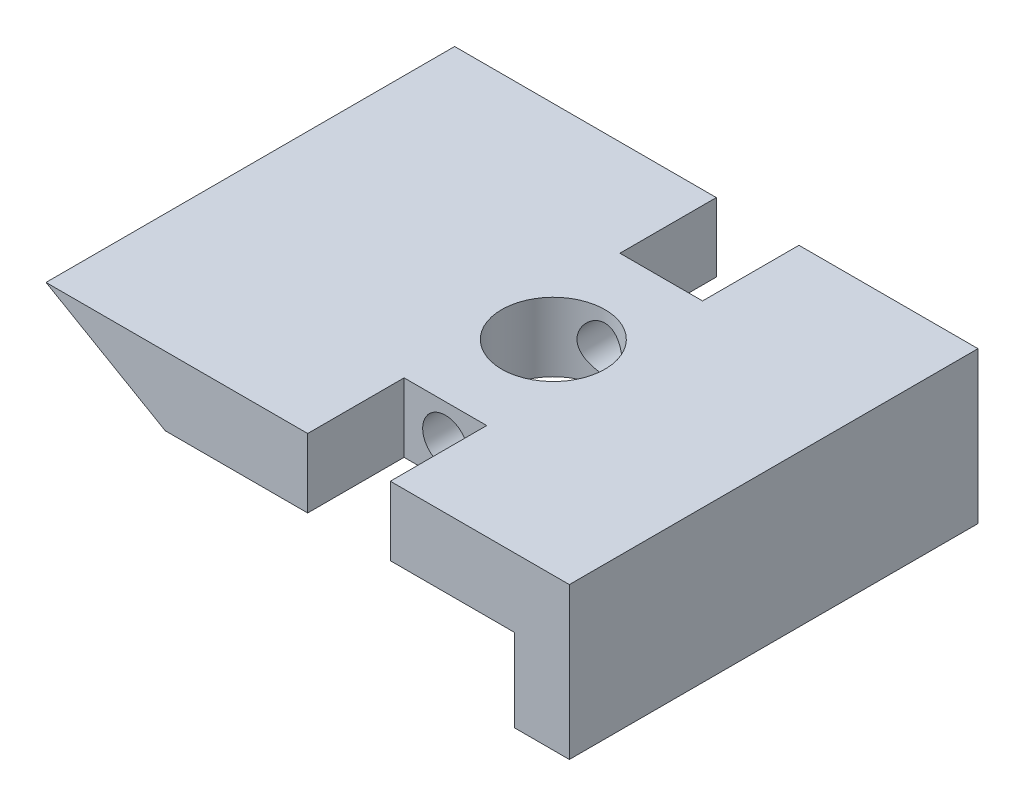
ISO-10303-21;
HEADER;
FILE_DESCRIPTION(('STEP AP214'),'2;1');
FILE_NAME('part.step','',(''),(''),'','','');
FILE_SCHEMA(('AUTOMOTIVE_DESIGN { 1 0 10303 214 1 1 1 1 }'));
ENDSEC;
DATA;
#1=APPLICATION_CONTEXT('core data for automotive mechanical design processes');
#2=APPLICATION_PROTOCOL_DEFINITION('international standard','automotive_design',2000,#1);
#3=PRODUCT_CONTEXT('',#1,'mechanical');
#4=PRODUCT('Part','Part','',(#3));
#5=PRODUCT_RELATED_PRODUCT_CATEGORY('part','',(#4));
#6=PRODUCT_DEFINITION_FORMATION('','',#4);
#7=PRODUCT_DEFINITION_CONTEXT('part definition',#1,'design');
#8=PRODUCT_DEFINITION('design','',#6,#7);
#9=PRODUCT_DEFINITION_SHAPE('','',#8);
#10=(LENGTH_UNIT() NAMED_UNIT(*) SI_UNIT(.MILLI.,.METRE.));
#11=(NAMED_UNIT(*) PLANE_ANGLE_UNIT() SI_UNIT($,.RADIAN.));
#12=(NAMED_UNIT(*) SI_UNIT($,.STERADIAN.) SOLID_ANGLE_UNIT());
#13=UNCERTAINTY_MEASURE_WITH_UNIT(LENGTH_MEASURE(1.E-05),#10,'distance_accuracy_value','');
#14=(GEOMETRIC_REPRESENTATION_CONTEXT(3) GLOBAL_UNCERTAINTY_ASSIGNED_CONTEXT((#13)) GLOBAL_UNIT_ASSIGNED_CONTEXT((#10,
#11,#12)) REPRESENTATION_CONTEXT('',''));
#15=CARTESIAN_POINT('',(0.,0.,0.));
#16=DIRECTION('',(0.,0.,1.));
#17=DIRECTION('',(1.,0.,0.));
#18=AXIS2_PLACEMENT_3D('',#15,#16,#17);
#19=CARTESIAN_POINT('',(3.,0.,-14.836));
#20=DIRECTION('',(0.,0.,1.));
#21=DIRECTION('',(1.,0.,0.));
#22=AXIS2_PLACEMENT_3D('',#19,#20,#21);
#23=CYLINDRICAL_SURFACE('',#22,1.65);
#24=CARTESIAN_POINT('',(4.65,0.,-3.36749164809655));
#25=CARTESIAN_POINT('',(4.64999591948725,-0.0874743691332474,-3.36749607292385));
#26=CARTESIAN_POINT('',(4.64299960015496,-0.175092773934513,-3.37094939684784));
#27=CARTESIAN_POINT('',(4.61531716545798,-0.34775711686567,-3.38429832583538));
#28=CARTESIAN_POINT('',(4.59459592274656,-0.432795867086391,-3.39421046041475));
#29=CARTESIAN_POINT('',(4.54044870220548,-0.597493099250677,-3.41912171212208));
#30=CARTESIAN_POINT('',(4.50707857419381,-0.677173445386291,-3.43409843617774));
#31=CARTESIAN_POINT('',(4.42874832845569,-0.829783884986517,-3.46741736925901));
#32=CARTESIAN_POINT('',(4.38379002894349,-0.902715034980066,-3.48575905018413));
#33=CARTESIAN_POINT('',(4.28021734567749,-1.04487154765316,-3.52516638479344));
#34=CARTESIAN_POINT('',(4.22091990046756,-1.11357209474115,-3.5463309106205));
#35=CARTESIAN_POINT('',(4.09178303274802,-1.240446840094,-3.5881911575404));
#36=CARTESIAN_POINT('',(4.02193928529622,-1.2986166981996,-3.60888668227713));
#37=CARTESIAN_POINT('',(3.86946484491626,-1.4055670834385,-3.64870271327509));
#38=CARTESIAN_POINT('',(3.78637319615618,-1.45374252984987,-3.66769507829857));
#39=CARTESIAN_POINT('',(3.61227632392994,-1.53520034882065,-3.700736202455));
#40=CARTESIAN_POINT('',(3.52127502438019,-1.56849005628031,-3.71478739560396));
#41=CARTESIAN_POINT('',(3.3394662745173,-1.61728382118505,-3.73565913311448));
#42=CARTESIAN_POINT('',(3.24894589824284,-1.63369687425849,-3.74284752867496));
#43=CARTESIAN_POINT('',(3.06617018053507,-1.65122350001049,-3.75052967187645));
#44=CARTESIAN_POINT('',(2.97391564874558,-1.65234404312535,-3.75102646959465));
#45=CARTESIAN_POINT('',(2.79695735459994,-1.63969762210197,-3.74547519866295));
#46=CARTESIAN_POINT('',(2.71216534970809,-1.62693375012661,-3.739868091581));
#47=CARTESIAN_POINT('',(2.5460705321449,-1.58862001141632,-3.72336083389609));
#48=CARTESIAN_POINT('',(2.46476797823857,-1.56306919822084,-3.71246029148675));
#49=CARTESIAN_POINT('',(2.30645273442336,-1.49962622377596,-3.68619520386884));
#50=CARTESIAN_POINT('',(2.22952453920683,-1.46155151512837,-3.67076501619212));
#51=CARTESIAN_POINT('',(2.08294686925941,-1.37433410623967,-3.63691910801703));
#52=CARTESIAN_POINT('',(2.01330005270581,-1.32518738450649,-3.6185023034251));
#53=CARTESIAN_POINT('',(1.87753504589473,-1.2128170119971,-3.57882020061428));
#54=CARTESIAN_POINT('',(1.81210572269681,-1.14879890575555,-3.5574447595915));
#55=CARTESIAN_POINT('',(1.69259260075723,-1.01070787762529,-3.51528240579217));
#56=CARTESIAN_POINT('',(1.63851423294623,-0.936630170451263,-3.49449577883282));
#57=CARTESIAN_POINT('',(1.54117220405855,-0.776800460066403,-3.45502479534648));
#58=CARTESIAN_POINT('',(1.49843008891747,-0.690699088400845,-3.43645839327868));
#59=CARTESIAN_POINT('',(1.42834028609234,-0.511490455495734,-3.40497856582965));
#60=CARTESIAN_POINT('',(1.40098013157646,-0.41838893735563,-3.39206056440346));
#61=CARTESIAN_POINT('',(1.36429227707905,-0.234744535363264,-3.37451456223478));
#62=CARTESIAN_POINT('',(1.35383875555708,-0.144476988157731,-3.36937064835985));
#63=CARTESIAN_POINT('',(1.34792333452705,0.0366498278836368,-3.3664757487194));
#64=CARTESIAN_POINT('',(1.35245516573099,0.127508833402344,-3.36872167133214));
#65=CARTESIAN_POINT('',(1.37535174013094,0.300038323378435,-3.37981562096985));
#66=CARTESIAN_POINT('',(1.39265374352297,0.381886932345066,-3.3881559621082));
#67=CARTESIAN_POINT('',(1.43914744636585,0.541431160999625,-3.40982287754369));
#68=CARTESIAN_POINT('',(1.46834214737761,0.619125726657321,-3.42315071054923));
#69=CARTESIAN_POINT('',(1.53921629690324,0.772027463841041,-3.45400682275722));
#70=CARTESIAN_POINT('',(1.58139272921155,0.846970827739317,-3.47169539316015));
#71=CARTESIAN_POINT('',(1.6765572613445,0.989101543315069,-3.50907546279441));
#72=CARTESIAN_POINT('',(1.72955038819797,1.05628526590526,-3.5287678911715));
#73=CARTESIAN_POINT('',(1.85062358980462,1.1874847750961,-3.57013856276202));
#74=CARTESIAN_POINT('',(1.9196470398001,1.25062896923802,-3.59183160476859));
#75=CARTESIAN_POINT('',(2.06778238636593,1.36462621623266,-3.63309467060809));
#76=CARTESIAN_POINT('',(2.14689558402023,1.41547768147164,-3.65266442003673));
#77=CARTESIAN_POINT('',(2.31400673932617,1.50362813045693,-3.68771558350776));
#78=CARTESIAN_POINT('',(2.40206664806587,1.54082304607771,-3.70316536765515));
#79=CARTESIAN_POINT('',(2.58405684732281,1.59956776607056,-3.72798894821772));
#80=CARTESIAN_POINT('',(2.6779831509097,1.62112807306507,-3.73736682301229));
#81=CARTESIAN_POINT('',(2.8612978165453,1.64656089333973,-3.74847245839303));
#82=CARTESIAN_POINT('',(2.95048512527525,1.65165818539735,-3.75072963755332));
#83=CARTESIAN_POINT('',(3.12843486064658,1.64739798838614,-3.74885512685435));
#84=CARTESIAN_POINT('',(3.21719737386056,1.63804358240264,-3.74472479968784));
#85=CARTESIAN_POINT('',(3.38782932587363,1.60602123171462,-3.7308324127445));
#86=CARTESIAN_POINT('',(3.46983114363675,1.58394115377816,-3.72131934376771));
#87=CARTESIAN_POINT('',(3.62890956243099,1.52777362465028,-3.69776205916142));
#88=CARTESIAN_POINT('',(3.70598528433432,1.49368403723099,-3.68371703743449));
#89=CARTESIAN_POINT('',(3.8569304617613,1.41274147649752,-3.65162935021383));
#90=CARTESIAN_POINT('',(3.93049119711801,1.3653752637279,-3.63343300227536));
#91=CARTESIAN_POINT('',(4.06894266820481,1.2599369507724,-3.59513976322225));
#92=CARTESIAN_POINT('',(4.13382977719906,1.20186039623366,-3.57504208305736));
#93=CARTESIAN_POINT('',(4.25831260974056,1.0713970399496,-3.53324031823005));
#94=CARTESIAN_POINT('',(4.31711532685678,0.998252385431571,-3.51153178279635));
#95=CARTESIAN_POINT('',(4.42177534917193,0.842529476107367,-3.47047923678989));
#96=CARTESIAN_POINT('',(4.46762474174624,0.759945498298501,-3.45113667556083));
#97=CARTESIAN_POINT('',(4.5449162136947,0.587124299309066,-3.41723991894322));
#98=CARTESIAN_POINT('',(4.57632700235197,0.496870953906528,-3.40269614232787));
#99=CARTESIAN_POINT('',(4.62309555077018,0.31164351772581,-3.38064338773551));
#100=CARTESIAN_POINT('',(4.6385071714776,0.216686400884627,-3.3731108155642));
#101=CARTESIAN_POINT('',(4.64703108329939,0.100998496777639,-3.36894448238601));
#102=CARTESIAN_POINT('',(4.64814335262455,0.0808209970433216,-3.36840080987488));
#103=CARTESIAN_POINT('',(4.64962829144477,0.0404315640214764,-3.3676738770119));
#104=CARTESIAN_POINT('',(4.65000094320723,0.02021962992,-3.36749062530128));
#105=CARTESIAN_POINT('',(4.65,0.,-3.36749164809655));
#106=B_SPLINE_CURVE_WITH_KNOTS('',3,(#24,#25,#26,#27,#28,#29,#30,#31,#32,#33,#34,#35,#36,#37,
#38,#39,#40,#41,#42,#43,#44,#45,#46,#47,#48,#49,#50,#51,#52,#53,#54,#55,#56,#57,#58,#59,#60,#61,
#62,#63,#64,#65,#66,#67,#68,#69,#70,#71,#72,#73,#74,#75,#76,#77,#78,#79,#80,#81,#82,#83,#84,#85,
#86,#87,#88,#89,#90,#91,#92,#93,#94,#95,#96,#97,#98,#99,#100,#101,#102,#103,#104,#105),
.UNSPECIFIED.,.T.,.F.,(4,2,2,2,2,2,2,2,2,2,2,2,2,2,2,2,2,2,2,2,2,2,2,2,2,2,2,2,2,2,2,2,2,2,2,2,
2,2,2,2,4),(0.,0.262337992001349,0.52535001551118,0.787214015160152,1.04903695265106,
1.32739302247777,1.60586355517072,1.89807751150631,2.19014732125288,2.46549872058573,
2.74072460857159,2.9973112845901,3.25391695538524,3.51444216606865,3.77506215572741,
4.05582705551463,4.33672598422601,4.62890596840992,4.92084880275994,5.1924046605751,
5.46384692437079,5.71493513596501,5.96608675823259,6.22839495294345,6.49082533337074,
6.77759301230099,7.06439770769602,7.35334470453729,7.64209741960136,7.90880391080322,
8.17545351143564,8.43067328899049,8.68593848747794,8.95289970595717,9.21997220307097,
9.50762420315226,9.79545153931286,10.0838997352209,10.371373694431,10.4320114560409,
10.4926506714452),.UNSPECIFIED.);
#107=CARTESIAN_POINT('',(4.65,0.,-3.36749164809655));
#108=VERTEX_POINT('',#107);
#109=EDGE_CURVE('E189',#108,#108,#106,.T.);
#110=ORIENTED_EDGE('',*,*,#109,.F.);
#111=EDGE_LOOP('',(#110));
#112=FACE_BOUND('',#111,.T.);
#113=CARTESIAN_POINT('',(3.,0.,-7.835));
#114=DIRECTION('',(0.,0.,1.));
#115=DIRECTION('',(1.,0.,0.));
#116=AXIS2_PLACEMENT_3D('',#113,#114,#115);
#117=CIRCLE('',#116,1.65);
#118=CARTESIAN_POINT('',(4.65,0.,-7.835));
#119=VERTEX_POINT('',#118);
#120=EDGE_CURVE('E522',#119,#119,#117,.T.);
#121=ORIENTED_EDGE('',*,*,#120,.F.);
#122=EDGE_LOOP('',(#121));
#123=FACE_BOUND('',#122,.T.);
#124=ADVANCED_FACE('F45',(#112,#123),#23,.F.);
#125=CARTESIAN_POINT('',(3.,-1.65,3.75));
#126=CARTESIAN_POINT('',(3.08794065243915,-1.64999603822561,3.74999677525689));
#127=CARTESIAN_POINT('',(3.17602118872722,-1.64292811014754,3.7468719189208));
#128=CARTESIAN_POINT('',(3.34965330491862,-1.61493414299233,3.734683166008));
#129=CARTESIAN_POINT('',(3.43519818666942,-1.59397431770864,3.72560479056562));
#130=CARTESIAN_POINT('',(3.60097235797527,-1.5391312845056,3.70247374212791));
#131=CARTESIAN_POINT('',(3.68121929706646,-1.505293822675,3.68843868963418));
#132=CARTESIAN_POINT('',(3.83481096834596,-1.42585820871192,3.65674015300381));
#133=CARTESIAN_POINT('',(3.90815735131846,-1.38026287916687,3.63907753990429));
#134=CARTESIAN_POINT('',(4.05000163649842,-1.27598104842036,3.60078615738986));
#135=CARTESIAN_POINT('',(4.11807366426439,-1.21675391782859,3.58005322837619));
#136=CARTESIAN_POINT('',(4.2436925761984,-1.08803679555134,3.53837779505836));
#137=CARTESIAN_POINT('',(4.30123331014303,-1.01854084946946,3.51743517577732));
#138=CARTESIAN_POINT('',(4.40737198125606,-0.866527492524002,3.47638120662905));
#139=CARTESIAN_POINT('',(4.45528386928224,-0.783497192018437,3.45638307676996));
#140=CARTESIAN_POINT('',(4.53627172599083,-0.609555260312117,3.4211597332649));
#141=CARTESIAN_POINT('',(4.56935619199839,-0.518648178890969,3.40593178742375));
#142=CARTESIAN_POINT('',(4.61794121689661,-0.336431274272992,3.3831135312385));
#143=CARTESIAN_POINT('',(4.63426566626132,-0.245387501455808,3.37516767353209));
#144=CARTESIAN_POINT('',(4.65143054751147,-0.0615333461945671,3.3668053594707));
#145=CARTESIAN_POINT('',(4.65228100759649,0.0312758530848424,3.36638402671406));
#146=CARTESIAN_POINT('',(4.63908919688508,0.207355873544219,3.3728210640382));
#147=CARTESIAN_POINT('',(4.6263414186449,0.290751689794494,3.37904671722602));
#148=CARTESIAN_POINT('',(4.58850520692875,0.454071225614267,3.39699646382114));
#149=CARTESIAN_POINT('',(4.56341407162607,0.533994180841886,3.40872176101459));
#150=CARTESIAN_POINT('',(4.50110649630305,0.690226926082278,3.43662073577462));
#151=CARTESIAN_POINT('',(4.46363227970243,0.766416489003947,3.45288773136686));
#152=CARTESIAN_POINT('',(4.37780710670809,0.911743878376031,3.48802159021638));
#153=CARTESIAN_POINT('',(4.32945161231713,0.980878745156235,3.50688953691531));
#154=CARTESIAN_POINT('',(4.21783776896922,1.1170679833526,3.54728261097474));
#155=CARTESIAN_POINT('',(4.15359849475329,1.18329659100235,3.56888963165699));
#156=CARTESIAN_POINT('',(4.01473808953318,1.30433611063186,3.61082599340459));
#157=CARTESIAN_POINT('',(3.94011395212262,1.35914370472459,3.63115496199219));
#158=CARTESIAN_POINT('',(3.7798454417349,1.45719190039968,3.66896451776513));
#159=CARTESIAN_POINT('',(3.69394811565676,1.50005943159355,3.68634771561839));
#160=CARTESIAN_POINT('',(3.51519989197508,1.57043908051859,3.71554130843415));
#161=CARTESIAN_POINT('',(3.42235333017466,1.59796068385571,3.72735514522372));
#162=CARTESIAN_POINT('',(3.23921022750968,1.63505304083377,3.74341295596741));
#163=CARTESIAN_POINT('',(3.14917854061997,1.64572966452197,3.74812228788192));
#164=CARTESIAN_POINT('',(2.96849247665595,1.65217171911425,3.75095455785044));
#165=CARTESIAN_POINT('',(2.87783831540075,1.64794208106068,3.74907967398628));
#166=CARTESIAN_POINT('',(2.70390665287527,1.62544881834208,3.73925037459651));
#167=CARTESIAN_POINT('',(2.62050230959726,1.60799437581934,3.73164663418775));
#168=CARTESIAN_POINT('',(2.45791706209694,1.56071027218963,3.71151728629914));
#169=CARTESIAN_POINT('',(2.37873667607145,1.53087909662229,3.69899107649862));
#170=CARTESIAN_POINT('',(2.22404079862632,1.45873229578337,3.66971134498956));
#171=CARTESIAN_POINT('',(2.14871703627142,1.41605581574277,3.65283800179973));
#172=CARTESIAN_POINT('',(2.00602810222664,1.31982329381418,3.61662102234894));
#173=CARTESIAN_POINT('',(1.93866640117435,1.26626253496257,3.5972763164179));
#174=CARTESIAN_POINT('',(1.80819611837274,1.14484038573232,3.55628214760163));
#175=CARTESIAN_POINT('',(1.74584598439285,1.07618271743489,3.53457144282308));
#176=CARTESIAN_POINT('',(1.63330445356359,0.929097206857131,3.49260064747062));
#177=CARTESIAN_POINT('',(1.58311709508679,0.850666132592151,3.47234104026915));
#178=CARTESIAN_POINT('',(1.49540307748589,0.683921591275962,3.43526035744154));
#179=CARTESIAN_POINT('',(1.45817723591055,0.595429542818637,3.4185241503665));
#180=CARTESIAN_POINT('',(1.39950438017547,0.412456963898668,3.39145640297362));
#181=CARTESIAN_POINT('',(1.37804232181517,0.31798223681692,3.38111875766089));
#182=CARTESIAN_POINT('',(1.35307874998712,0.134229339541118,3.36902436868046));
#183=CARTESIAN_POINT('',(1.34822601990919,0.0451768053067855,3.36662264808986));
#184=CARTESIAN_POINT('',(1.35292803694661,-0.132443324028021,3.36892598901368));
#185=CARTESIAN_POINT('',(1.36247987258739,-0.221011013494953,3.37362961438419));
#186=CARTESIAN_POINT('',(1.39454415171674,-0.389834130472385,3.38899632048545));
#187=CARTESIAN_POINT('',(1.41627535473376,-0.470274087988891,3.39929913530276));
#188=CARTESIAN_POINT('',(1.4712672768033,-0.626361280798593,3.42438089295876));
#189=CARTESIAN_POINT('',(1.50453131275969,-0.702007129869672,3.43916112337134));
#190=CARTESIAN_POINT('',(1.58406507679427,-0.851619735953305,3.47269356886383));
#191=CARTESIAN_POINT('',(1.63102681157857,-0.925174495154697,3.49163847278619));
#192=CARTESIAN_POINT('',(1.7357127896172,-1.06377992281056,3.53089238653571));
#193=CARTESIAN_POINT('',(1.79344141213049,-1.12882711256769,3.55120194925799));
#194=CARTESIAN_POINT('',(1.92382903951875,-1.25428003578287,3.59296880703805));
#195=CARTESIAN_POINT('',(1.99734015606778,-1.31382091586417,3.6143768693599));
#196=CARTESIAN_POINT('',(2.15406955877593,-1.41980560454866,3.65423468677977));
#197=CARTESIAN_POINT('',(2.23729223810855,-1.46624345307615,3.67268309400139));
#198=CARTESIAN_POINT('',(2.41023740744422,-1.54387701756614,3.70436408768263));
#199=CARTESIAN_POINT('',(2.49986734754799,-1.57525320509647,3.71765804406783));
#200=CARTESIAN_POINT('',(2.68371482188615,-1.62216171678277,3.73777368374933));
#201=CARTESIAN_POINT('',(2.77791736039553,-1.63774259010252,3.74461519501638));
#202=CARTESIAN_POINT('',(2.89387606102141,-1.64672172070879,3.7485588513459));
#203=CARTESIAN_POINT('',(2.91507632147087,-1.64794995964319,3.74909837906909));
#204=CARTESIAN_POINT('',(2.95751499929637,-1.64958958196251,3.74981934473969));
#205=CARTESIAN_POINT('',(2.97875341705226,-1.65000095717016,3.75000077910238));
#206=CARTESIAN_POINT('',(3.,-1.65,3.75));
#207=B_SPLINE_CURVE_WITH_KNOTS('',3,(#125,#126,#127,#128,#129,#130,#131,#132,#133,#134,#135,
#136,#137,#138,#139,#140,#141,#142,#143,#144,#145,#146,#147,#148,#149,#150,#151,#152,#153,#154,
#155,#156,#157,#158,#159,#160,#161,#162,#163,#164,#165,#166,#167,#168,#169,#170,#171,#172,#173,
#174,#175,#176,#177,#178,#179,#180,#181,#182,#183,#184,#185,#186,#187,#188,#189,#190,#191,#192,
#193,#194,#195,#196,#197,#198,#199,#200,#201,#202,#203,#204,#205,#206),.UNSPECIFIED.,.T.,.F.,(4,
2,2,2,2,2,2,2,2,2,2,2,2,2,2,2,2,2,2,2,2,2,2,2,2,2,2,2,2,2,2,2,2,2,2,2,2,2,2,2,4),(0.,
0.263734510147988,0.52811280905045,0.791560575603074,1.05494515780487,1.33150079465859,
1.60821742685178,1.90051649596435,2.19264783893791,2.46960925800041,2.74639118079142,
2.99899429642278,3.25165272874969,3.50994222706956,3.76833964437948,4.05135561937526,
4.33445369828947,4.62559874662744,4.91656363268483,5.18748705235547,5.45832085804592,
5.71380105020368,5.96931251303604,6.23280504553125,6.49641201330446,6.78088013255853,
7.06544257396593,7.35622693243307,7.64673341835486,7.91295937269032,8.17913152420861,
8.42991502344918,8.68077070926696,8.94756356427704,9.21446517058845,9.50405959505639,
9.79378553355286,10.0799474542432,10.3652271238324,10.4289451074685,10.4926637289549),.UNSPECIFIED.);
#208=CARTESIAN_POINT('',(3.,-1.65,3.75));
#209=VERTEX_POINT('',#208);
#210=EDGE_CURVE('E198',#209,#209,#207,.T.);
#211=ORIENTED_EDGE('',*,*,#210,.F.);
#212=EDGE_LOOP('',(#211));
#213=FACE_BOUND('',#212,.T.);
#214=CARTESIAN_POINT('',(3.,0.,7.835));
#215=DIRECTION('',(0.,0.,1.));
#216=DIRECTION('',(1.,0.,0.));
#217=AXIS2_PLACEMENT_3D('',#214,#215,#216);
#218=CIRCLE('',#217,1.65);
#219=CARTESIAN_POINT('',(4.65,0.,7.835));
#220=VERTEX_POINT('',#219);
#221=EDGE_CURVE('E482',#220,#220,#218,.T.);
#222=ORIENTED_EDGE('',*,*,#221,.T.);
#223=EDGE_LOOP('',(#222));
#224=FACE_BOUND('',#223,.T.);
#225=ADVANCED_FACE('F215',(#213,#224),#23,.F.);
#226=CARTESIAN_POINT('',(-19.,2.5,14.835));
#227=DIRECTION('',(0.,-1.,0.));
#228=DIRECTION('',(1.,0.,0.));
#229=AXIS2_PLACEMENT_3D('',#226,#227,#228);
#230=PLANE('',#229);
#231=CARTESIAN_POINT('',(3.,2.5,0.));
#232=DIRECTION('',(0.,1.,0.));
#233=DIRECTION('',(0.,0.,1.));
#234=AXIS2_PLACEMENT_3D('',#231,#232,#233);
#235=CIRCLE('',#234,3.75);
#236=CARTESIAN_POINT('',(3.,2.5,3.75));
#237=VERTEX_POINT('',#236);
#238=EDGE_CURVE('E181',#237,#237,#235,.T.);
#239=ORIENTED_EDGE('',*,*,#238,.F.);
#240=EDGE_LOOP('',(#239));
#241=FACE_BOUND('',#240,.T.);
#242=DIRECTION('',(0.,0.,-1.));
#243=VECTOR('',#242,1.);
#244=CARTESIAN_POINT('',(0.,2.5,-7.835));
#245=LINE('',#244,#243);
#246=CARTESIAN_POINT('',(0.,2.5,-7.835));
#247=VERTEX_POINT('',#246);
#248=CARTESIAN_POINT('',(0.,2.5,-14.835));
#249=VERTEX_POINT('',#248);
#250=EDGE_CURVE('E255',#247,#249,#245,.T.);
#251=ORIENTED_EDGE('',*,*,#250,.T.);
#252=DIRECTION('',(-1.,0.,0.));
#253=VECTOR('',#252,1.);
#254=CARTESIAN_POINT('',(-19.,2.5,-14.835));
#255=LINE('',#254,#253);
#256=CARTESIAN_POINT('',(-19.,2.5,-14.835));
#257=VERTEX_POINT('',#256);
#258=EDGE_CURVE('E258',#249,#257,#255,.T.);
#259=ORIENTED_EDGE('',*,*,#258,.T.);
#260=DIRECTION('',(0.,0.,-1.));
#261=VECTOR('',#260,1.);
#262=CARTESIAN_POINT('',(-19.,2.5,14.835));
#263=LINE('',#262,#261);
#264=CARTESIAN_POINT('',(-19.,2.5,14.835));
#265=VERTEX_POINT('',#264);
#266=EDGE_CURVE('E54',#265,#257,#263,.T.);
#267=ORIENTED_EDGE('',*,*,#266,.F.);
#268=DIRECTION('',(-1.,0.,0.));
#269=VECTOR('',#268,1.);
#270=CARTESIAN_POINT('',(-19.,2.5,14.835));
#271=LINE('',#270,#269);
#272=CARTESIAN_POINT('',(0.,2.5,14.835));
#273=VERTEX_POINT('',#272);
#274=EDGE_CURVE('E301',#273,#265,#271,.T.);
#275=ORIENTED_EDGE('',*,*,#274,.F.);
#276=DIRECTION('',(0.,0.,1.));
#277=VECTOR('',#276,1.);
#278=CARTESIAN_POINT('',(0.,2.5,7.835));
#279=LINE('',#278,#277);
#280=CARTESIAN_POINT('',(0.,2.5,7.835));
#281=VERTEX_POINT('',#280);
#282=EDGE_CURVE('E280',#281,#273,#279,.T.);
#283=ORIENTED_EDGE('',*,*,#282,.F.);
#284=DIRECTION('',(-1.,0.,0.));
#285=VECTOR('',#284,1.);
#286=CARTESIAN_POINT('',(6.,2.5,7.835));
#287=LINE('',#286,#285);
#288=CARTESIAN_POINT('',(6.,2.5,7.835));
#289=VERTEX_POINT('',#288);
#290=EDGE_CURVE('E487',#289,#281,#287,.T.);
#291=ORIENTED_EDGE('',*,*,#290,.F.);
#292=DIRECTION('',(0.,0.,1.));
#293=VECTOR('',#292,1.);
#294=CARTESIAN_POINT('',(6.,2.5,7.835));
#295=LINE('',#294,#293);
#296=CARTESIAN_POINT('',(6.,2.5,14.835));
#297=VERTEX_POINT('',#296);
#298=EDGE_CURVE('E490',#289,#297,#295,.T.);
#299=ORIENTED_EDGE('',*,*,#298,.T.);
#300=CARTESIAN_POINT('',(19.,2.5,14.835));
#301=VERTEX_POINT('',#300);
#302=EDGE_CURVE('E306',#301,#297,#271,.T.);
#303=ORIENTED_EDGE('',*,*,#302,.F.);
#304=DIRECTION('',(0.,0.,-1.));
#305=VECTOR('',#304,1.);
#306=CARTESIAN_POINT('',(19.,2.5,14.835));
#307=LINE('',#306,#305);
#308=CARTESIAN_POINT('',(19.,2.5,-14.835));
#309=VERTEX_POINT('',#308);
#310=EDGE_CURVE('E11',#301,#309,#307,.T.);
#311=ORIENTED_EDGE('',*,*,#310,.T.);
#312=CARTESIAN_POINT('',(6.,2.5,-14.835));
#313=VERTEX_POINT('',#312);
#314=EDGE_CURVE('E275',#309,#313,#255,.T.);
#315=ORIENTED_EDGE('',*,*,#314,.T.);
#316=DIRECTION('',(0.,0.,-1.));
#317=VECTOR('',#316,1.);
#318=CARTESIAN_POINT('',(6.,2.5,-7.835));
#319=LINE('',#318,#317);
#320=CARTESIAN_POINT('',(6.,2.5,-7.835));
#321=VERTEX_POINT('',#320);
#322=EDGE_CURVE('E69',#321,#313,#319,.T.);
#323=ORIENTED_EDGE('',*,*,#322,.F.);
#324=DIRECTION('',(-1.,0.,0.));
#325=VECTOR('',#324,1.);
#326=CARTESIAN_POINT('',(6.,2.5,-7.835));
#327=LINE('',#326,#325);
#328=EDGE_CURVE('E261',#321,#247,#327,.T.);
#329=ORIENTED_EDGE('',*,*,#328,.T.);
#330=EDGE_LOOP('',(#251,#259,#267,#275,#283,#291,#299,#303,#311,#315,#323,#329));
#331=FACE_BOUND('',#330,.T.);
#332=ADVANCED_FACE('F222',(#241,#331),#230,.F.);
#333=CARTESIAN_POINT('',(-10.3397459621556,-2.5,14.835));
#334=DIRECTION('',(0.,1.,0.));
#335=DIRECTION('',(0.,0.,1.));
#336=AXIS2_PLACEMENT_3D('',#333,#334,#335);
#337=PLANE('',#336);
#338=CARTESIAN_POINT('',(3.,-2.5,0.));
#339=DIRECTION('',(0.,1.,0.));
#340=DIRECTION('',(0.,0.,1.));
#341=AXIS2_PLACEMENT_3D('',#338,#339,#340);
#342=CIRCLE('',#341,3.75);
#343=CARTESIAN_POINT('',(3.,-2.5,3.75));
#344=VERTEX_POINT('',#343);
#345=EDGE_CURVE('E185',#344,#344,#342,.F.);
#346=ORIENTED_EDGE('',*,*,#345,.F.);
#347=EDGE_LOOP('',(#346));
#348=FACE_BOUND('',#347,.T.);
#349=DIRECTION('',(1.,0.,0.));
#350=VECTOR('',#349,1.);
#351=CARTESIAN_POINT('',(-10.3397459621556,-2.5,-14.835));
#352=LINE('',#351,#350);
#353=CARTESIAN_POINT('',(6.,-2.5,-14.835));
#354=VERTEX_POINT('',#353);
#355=CARTESIAN_POINT('',(15.,-2.5,-14.835));
#356=VERTEX_POINT('',#355);
#357=EDGE_CURVE('E286',#354,#356,#352,.T.);
#358=ORIENTED_EDGE('',*,*,#357,.T.);
#359=DIRECTION('',(0.,0.,1.));
#360=VECTOR('',#359,1.);
#361=CARTESIAN_POINT('',(15.,-2.5,-22.046102550928));
#362=LINE('',#361,#360);
#363=CARTESIAN_POINT('',(15.,-2.5,14.835));
#364=VERTEX_POINT('',#363);
#365=EDGE_CURVE('E169',#356,#364,#362,.T.);
#366=ORIENTED_EDGE('',*,*,#365,.T.);
#367=DIRECTION('',(1.,0.,0.));
#368=VECTOR('',#367,1.);
#369=CARTESIAN_POINT('',(-10.3397459621556,-2.5,14.835));
#370=LINE('',#369,#368);
#371=CARTESIAN_POINT('',(5.99999999999999,-2.5,14.835));
#372=VERTEX_POINT('',#371);
#373=EDGE_CURVE('E316',#372,#364,#370,.T.);
#374=ORIENTED_EDGE('',*,*,#373,.F.);
#375=DIRECTION('',(0.,0.,1.));
#376=VECTOR('',#375,1.);
#377=CARTESIAN_POINT('',(6.,-2.5,7.835));
#378=LINE('',#377,#376);
#379=CARTESIAN_POINT('',(6.,-2.5,7.835));
#380=VERTEX_POINT('',#379);
#381=EDGE_CURVE('E328',#380,#372,#378,.T.);
#382=ORIENTED_EDGE('',*,*,#381,.F.);
#383=DIRECTION('',(1.,0.,0.));
#384=VECTOR('',#383,1.);
#385=CARTESIAN_POINT('',(6.,-2.5,7.835));
#386=LINE('',#385,#384);
#387=CARTESIAN_POINT('',(0.,-2.5,7.835));
#388=VERTEX_POINT('',#387);
#389=EDGE_CURVE('E485',#388,#380,#386,.T.);
#390=ORIENTED_EDGE('',*,*,#389,.F.);
#391=DIRECTION('',(0.,0.,1.));
#392=VECTOR('',#391,1.);
#393=CARTESIAN_POINT('',(0.,-2.5,7.835));
#394=LINE('',#393,#392);
#395=CARTESIAN_POINT('',(0.,-2.5,14.835));
#396=VERTEX_POINT('',#395);
#397=EDGE_CURVE('E479',#388,#396,#394,.T.);
#398=ORIENTED_EDGE('',*,*,#397,.T.);
#399=CARTESIAN_POINT('',(-10.3397459621556,-2.5,14.835));
#400=VERTEX_POINT('',#399);
#401=EDGE_CURVE('E294',#400,#396,#370,.T.);
#402=ORIENTED_EDGE('',*,*,#401,.F.);
#403=DIRECTION('',(0.,0.,-1.));
#404=VECTOR('',#403,1.);
#405=CARTESIAN_POINT('',(-10.3397459621556,-2.5,14.835));
#406=LINE('',#405,#404);
#407=CARTESIAN_POINT('',(-10.3397459621556,-2.5,-14.835));
#408=VERTEX_POINT('',#407);
#409=EDGE_CURVE('E291',#400,#408,#406,.T.);
#410=ORIENTED_EDGE('',*,*,#409,.T.);
#411=CARTESIAN_POINT('',(0.,-2.5,-14.835));
#412=VERTEX_POINT('',#411);
#413=EDGE_CURVE('E287',#408,#412,#352,.T.);
#414=ORIENTED_EDGE('',*,*,#413,.T.);
#415=DIRECTION('',(0.,0.,-1.));
#416=VECTOR('',#415,1.);
#417=CARTESIAN_POINT('',(0.,-2.5,-7.835));
#418=LINE('',#417,#416);
#419=CARTESIAN_POINT('',(0.,-2.5,-7.835));
#420=VERTEX_POINT('',#419);
#421=EDGE_CURVE('E512',#420,#412,#418,.T.);
#422=ORIENTED_EDGE('',*,*,#421,.F.);
#423=DIRECTION('',(1.,0.,0.));
#424=VECTOR('',#423,1.);
#425=CARTESIAN_POINT('',(6.,-2.5,-7.835));
#426=LINE('',#425,#424);
#427=CARTESIAN_POINT('',(6.,-2.5,-7.835));
#428=VERTEX_POINT('',#427);
#429=EDGE_CURVE('E266',#420,#428,#426,.T.);
#430=ORIENTED_EDGE('',*,*,#429,.T.);
#431=DIRECTION('',(0.,0.,-1.));
#432=VECTOR('',#431,1.);
#433=CARTESIAN_POINT('',(6.,-2.5,-7.835));
#434=LINE('',#433,#432);
#435=EDGE_CURVE('E331',#428,#354,#434,.T.);
#436=ORIENTED_EDGE('',*,*,#435,.T.);
#437=EDGE_LOOP('',(#358,#366,#374,#382,#390,#398,#402,#410,#414,#422,#430,#436));
#438=FACE_BOUND('',#437,.T.);
#439=ADVANCED_FACE('F239',(#348,#438),#337,.F.);
#440=CARTESIAN_POINT('',(0.,0.,-14.835));
#441=DIRECTION('',(0.,0.,-1.));
#442=DIRECTION('',(-1.,0.,0.));
#443=AXIS2_PLACEMENT_3D('',#440,#441,#442);
#444=PLANE('',#443);
#445=ORIENTED_EDGE('',*,*,#258,.F.);
#446=DIRECTION('',(0.,-1.,0.));
#447=VECTOR('',#446,1.);
#448=CARTESIAN_POINT('',(0.,-2.5,-14.835));
#449=LINE('',#448,#447);
#450=EDGE_CURVE('E271',#249,#412,#449,.T.);
#451=ORIENTED_EDGE('',*,*,#450,.T.);
#452=ORIENTED_EDGE('',*,*,#413,.F.);
#453=DIRECTION('',(0.866025403784438,-0.500000000000001,0.));
#454=VECTOR('',#453,1.);
#455=CARTESIAN_POINT('',(-19.,2.5,-14.835));
#456=LINE('',#455,#454);
#457=EDGE_CURVE('E273',#257,#408,#456,.T.);
#458=ORIENTED_EDGE('',*,*,#457,.F.);
#459=EDGE_LOOP('',(#445,#451,#452,#458));
#460=FACE_BOUND('',#459,.T.);
#461=ADVANCED_FACE('F236',(#460),#444,.T.);
#462=ORIENTED_EDGE('',*,*,#357,.F.);
#463=DIRECTION('',(0.,1.,0.));
#464=VECTOR('',#463,1.);
#465=CARTESIAN_POINT('',(6.,-2.5,-14.835));
#466=LINE('',#465,#464);
#467=EDGE_CURVE('E333',#354,#313,#466,.T.);
#468=ORIENTED_EDGE('',*,*,#467,.T.);
#469=ORIENTED_EDGE('',*,*,#314,.F.);
#470=DIRECTION('',(0.,1.,0.));
#471=VECTOR('',#470,1.);
#472=CARTESIAN_POINT('',(19.,-2.5,-14.835));
#473=LINE('',#472,#471);
#474=CARTESIAN_POINT('',(19.,-8.5,-14.835));
#475=VERTEX_POINT('',#474);
#476=EDGE_CURVE('E154',#475,#309,#473,.T.);
#477=ORIENTED_EDGE('',*,*,#476,.F.);
#478=DIRECTION('',(1.,0.,0.));
#479=VECTOR('',#478,1.);
#480=CARTESIAN_POINT('',(19.,-8.5,-14.835));
#481=LINE('',#480,#479);
#482=CARTESIAN_POINT('',(15.,-8.5,-14.835));
#483=VERTEX_POINT('',#482);
#484=EDGE_CURVE('E147',#483,#475,#481,.T.);
#485=ORIENTED_EDGE('',*,*,#484,.F.);
#486=DIRECTION('',(0.,-1.,0.));
#487=VECTOR('',#486,1.);
#488=CARTESIAN_POINT('',(15.,-8.5,-14.835));
#489=LINE('',#488,#487);
#490=EDGE_CURVE('E152',#356,#483,#489,.T.);
#491=ORIENTED_EDGE('',*,*,#490,.F.);
#492=EDGE_LOOP('',(#462,#468,#469,#477,#485,#491));
#493=FACE_BOUND('',#492,.T.);
#494=ADVANCED_FACE('F150',(#493),#444,.T.);
#495=CARTESIAN_POINT('',(0.,0.,14.835));
#496=DIRECTION('',(0.,0.,-1.));
#497=DIRECTION('',(-1.,0.,0.));
#498=AXIS2_PLACEMENT_3D('',#495,#496,#497);
#499=PLANE('',#498);
#500=ORIENTED_EDGE('',*,*,#401,.T.);
#501=DIRECTION('',(0.,-1.,0.));
#502=VECTOR('',#501,1.);
#503=CARTESIAN_POINT('',(0.,-2.5,14.835));
#504=LINE('',#503,#502);
#505=EDGE_CURVE('E477',#273,#396,#504,.T.);
#506=ORIENTED_EDGE('',*,*,#505,.F.);
#507=ORIENTED_EDGE('',*,*,#274,.T.);
#508=DIRECTION('',(0.866025403784438,-0.500000000000001,0.));
#509=VECTOR('',#508,1.);
#510=CARTESIAN_POINT('',(-19.,2.5,14.835));
#511=LINE('',#510,#509);
#512=EDGE_CURVE('E298',#265,#400,#511,.T.);
#513=ORIENTED_EDGE('',*,*,#512,.T.);
#514=EDGE_LOOP('',(#500,#506,#507,#513));
#515=FACE_BOUND('',#514,.T.);
#516=ADVANCED_FACE('F235',(#515),#499,.F.);
#517=CARTESIAN_POINT('',(19.,-2.5,14.835));
#518=DIRECTION('',(-1.,0.,0.));
#519=DIRECTION('',(0.,0.,1.));
#520=AXIS2_PLACEMENT_3D('',#517,#518,#519);
#521=PLANE('',#520);
#522=ORIENTED_EDGE('',*,*,#476,.T.);
#523=ORIENTED_EDGE('',*,*,#310,.F.);
#524=DIRECTION('',(0.,1.,0.));
#525=VECTOR('',#524,1.);
#526=CARTESIAN_POINT('',(19.,-2.5,14.835));
#527=LINE('',#526,#525);
#528=CARTESIAN_POINT('',(19.,-8.5,14.835));
#529=VERTEX_POINT('',#528);
#530=EDGE_CURVE('E290',#529,#301,#527,.T.);
#531=ORIENTED_EDGE('',*,*,#530,.F.);
#532=DIRECTION('',(0.,0.,1.));
#533=VECTOR('',#532,1.);
#534=CARTESIAN_POINT('',(19.,-8.5,-22.046102550928));
#535=LINE('',#534,#533);
#536=EDGE_CURVE('E159',#475,#529,#535,.T.);
#537=ORIENTED_EDGE('',*,*,#536,.F.);
#538=EDGE_LOOP('',(#522,#523,#531,#537));
#539=FACE_BOUND('',#538,.T.);
#540=ADVANCED_FACE('F47',(#539),#521,.F.);
#541=CARTESIAN_POINT('',(-19.,2.5,14.835));
#542=DIRECTION('',(0.500000000000001,0.866025403784438,0.));
#543=DIRECTION('',(-0.866025403784438,0.500000000000001,0.));
#544=AXIS2_PLACEMENT_3D('',#541,#542,#543);
#545=PLANE('',#544);
#546=ORIENTED_EDGE('',*,*,#457,.T.);
#547=ORIENTED_EDGE('',*,*,#409,.F.);
#548=ORIENTED_EDGE('',*,*,#512,.F.);
#549=ORIENTED_EDGE('',*,*,#266,.T.);
#550=EDGE_LOOP('',(#546,#547,#548,#549));
#551=FACE_BOUND('',#550,.T.);
#552=ADVANCED_FACE('F233',(#551),#545,.F.);
#553=ORIENTED_EDGE('',*,*,#302,.T.);
#554=DIRECTION('',(0.,1.,0.));
#555=VECTOR('',#554,1.);
#556=CARTESIAN_POINT('',(6.,-2.5,14.835));
#557=LINE('',#556,#555);
#558=EDGE_CURVE('E324',#372,#297,#557,.T.);
#559=ORIENTED_EDGE('',*,*,#558,.F.);
#560=ORIENTED_EDGE('',*,*,#373,.T.);
#561=DIRECTION('',(0.,-1.,0.));
#562=VECTOR('',#561,1.);
#563=CARTESIAN_POINT('',(15.,-8.5,14.835));
#564=LINE('',#563,#562);
#565=CARTESIAN_POINT('',(15.,-8.5,14.835));
#566=VERTEX_POINT('',#565);
#567=EDGE_CURVE('E61',#364,#566,#564,.T.);
#568=ORIENTED_EDGE('',*,*,#567,.T.);
#569=DIRECTION('',(1.,0.,0.));
#570=VECTOR('',#569,1.);
#571=CARTESIAN_POINT('',(19.,-8.5,14.835));
#572=LINE('',#571,#570);
#573=EDGE_CURVE('E165',#566,#529,#572,.T.);
#574=ORIENTED_EDGE('',*,*,#573,.T.);
#575=ORIENTED_EDGE('',*,*,#530,.T.);
#576=EDGE_LOOP('',(#553,#559,#560,#568,#574,#575));
#577=FACE_BOUND('',#576,.T.);
#578=ADVANCED_FACE('F230',(#577),#499,.F.);
#579=CARTESIAN_POINT('',(0.,-2.5,7.835));
#580=DIRECTION('',(-1.,0.,0.));
#581=DIRECTION('',(0.,0.,1.));
#582=AXIS2_PLACEMENT_3D('',#579,#580,#581);
#583=PLANE('',#582);
#584=ORIENTED_EDGE('',*,*,#505,.T.);
#585=ORIENTED_EDGE('',*,*,#397,.F.);
#586=DIRECTION('',(0.,-1.,0.));
#587=VECTOR('',#586,1.);
#588=CARTESIAN_POINT('',(0.,-2.5,7.835));
#589=LINE('',#588,#587);
#590=EDGE_CURVE('E501',#281,#388,#589,.T.);
#591=ORIENTED_EDGE('',*,*,#590,.F.);
#592=ORIENTED_EDGE('',*,*,#282,.T.);
#593=EDGE_LOOP('',(#584,#585,#591,#592));
#594=FACE_BOUND('',#593,.T.);
#595=ADVANCED_FACE('F228',(#594),#583,.F.);
#596=CARTESIAN_POINT('',(6.,-2.5,7.835));
#597=DIRECTION('',(1.,0.,0.));
#598=DIRECTION('',(0.,0.,-1.));
#599=AXIS2_PLACEMENT_3D('',#596,#597,#598);
#600=PLANE('',#599);
#601=ORIENTED_EDGE('',*,*,#558,.T.);
#602=ORIENTED_EDGE('',*,*,#298,.F.);
#603=DIRECTION('',(0.,1.,0.));
#604=VECTOR('',#603,1.);
#605=CARTESIAN_POINT('',(6.,-2.5,7.835));
#606=LINE('',#605,#604);
#607=EDGE_CURVE('E493',#380,#289,#606,.T.);
#608=ORIENTED_EDGE('',*,*,#607,.F.);
#609=ORIENTED_EDGE('',*,*,#381,.T.);
#610=EDGE_LOOP('',(#601,#602,#608,#609));
#611=FACE_BOUND('',#610,.T.);
#612=ADVANCED_FACE('F423',(#611),#600,.F.);
#613=CARTESIAN_POINT('',(0.,0.,7.835));
#614=DIRECTION('',(0.,0.,1.));
#615=DIRECTION('',(1.,0.,0.));
#616=AXIS2_PLACEMENT_3D('',#613,#614,#615);
#617=PLANE('',#616);
#618=ORIENTED_EDGE('',*,*,#221,.F.);
#619=EDGE_LOOP('',(#618));
#620=FACE_BOUND('',#619,.T.);
#621=ORIENTED_EDGE('',*,*,#590,.T.);
#622=ORIENTED_EDGE('',*,*,#389,.T.);
#623=ORIENTED_EDGE('',*,*,#607,.T.);
#624=ORIENTED_EDGE('',*,*,#290,.T.);
#625=EDGE_LOOP('',(#621,#622,#623,#624));
#626=FACE_BOUND('',#625,.T.);
#627=ADVANCED_FACE('F394',(#620,#626),#617,.T.);
#628=CARTESIAN_POINT('',(0.,0.,-7.835));
#629=DIRECTION('',(0.,0.,-1.));
#630=DIRECTION('',(1.,0.,0.));
#631=AXIS2_PLACEMENT_3D('',#628,#629,#630);
#632=PLANE('',#631);
#633=DIRECTION('',(0.,-1.,0.));
#634=VECTOR('',#633,1.);
#635=CARTESIAN_POINT('',(0.,-2.5,-7.835));
#636=LINE('',#635,#634);
#637=EDGE_CURVE('E335',#247,#420,#636,.T.);
#638=ORIENTED_EDGE('',*,*,#637,.F.);
#639=ORIENTED_EDGE('',*,*,#328,.F.);
#640=DIRECTION('',(0.,1.,0.));
#641=VECTOR('',#640,1.);
#642=CARTESIAN_POINT('',(6.,-2.5,-7.835));
#643=LINE('',#642,#641);
#644=EDGE_CURVE('E525',#428,#321,#643,.T.);
#645=ORIENTED_EDGE('',*,*,#644,.F.);
#646=ORIENTED_EDGE('',*,*,#429,.F.);
#647=EDGE_LOOP('',(#638,#639,#645,#646));
#648=FACE_BOUND('',#647,.T.);
#649=ORIENTED_EDGE('',*,*,#120,.T.);
#650=EDGE_LOOP('',(#649));
#651=FACE_BOUND('',#650,.T.);
#652=ADVANCED_FACE('F385',(#648,#651),#632,.T.);
#653=CARTESIAN_POINT('',(0.,-2.5,-7.835));
#654=DIRECTION('',(1.,0.,0.));
#655=DIRECTION('',(0.,0.,-1.));
#656=AXIS2_PLACEMENT_3D('',#653,#654,#655);
#657=PLANE('',#656);
#658=ORIENTED_EDGE('',*,*,#450,.F.);
#659=ORIENTED_EDGE('',*,*,#250,.F.);
#660=ORIENTED_EDGE('',*,*,#637,.T.);
#661=ORIENTED_EDGE('',*,*,#421,.T.);
#662=EDGE_LOOP('',(#658,#659,#660,#661));
#663=FACE_BOUND('',#662,.T.);
#664=ADVANCED_FACE('F376',(#663),#657,.T.);
#665=CARTESIAN_POINT('',(6.,-2.5,-7.835));
#666=DIRECTION('',(-1.,0.,0.));
#667=DIRECTION('',(0.,0.,1.));
#668=AXIS2_PLACEMENT_3D('',#665,#666,#667);
#669=PLANE('',#668);
#670=ORIENTED_EDGE('',*,*,#467,.F.);
#671=ORIENTED_EDGE('',*,*,#435,.F.);
#672=ORIENTED_EDGE('',*,*,#644,.T.);
#673=ORIENTED_EDGE('',*,*,#322,.T.);
#674=EDGE_LOOP('',(#670,#671,#672,#673));
#675=FACE_BOUND('',#674,.T.);
#676=ADVANCED_FACE('F360',(#675),#669,.T.);
#677=CARTESIAN_POINT('',(3.,-2.501,0.));
#678=DIRECTION('',(0.,1.,0.));
#679=DIRECTION('',(0.,0.,1.));
#680=AXIS2_PLACEMENT_3D('',#677,#678,#679);
#681=CYLINDRICAL_SURFACE('',#680,3.75);
#682=ORIENTED_EDGE('',*,*,#238,.T.);
#683=EDGE_LOOP('',(#682));
#684=FACE_BOUND('',#683,.T.);
#685=ORIENTED_EDGE('',*,*,#345,.T.);
#686=EDGE_LOOP('',(#685));
#687=FACE_BOUND('',#686,.T.);
#688=ORIENTED_EDGE('',*,*,#109,.T.);
#689=EDGE_LOOP('',(#688));
#690=FACE_BOUND('',#689,.T.);
#691=ORIENTED_EDGE('',*,*,#210,.T.);
#692=EDGE_LOOP('',(#691));
#693=FACE_BOUND('',#692,.T.);
#694=ADVANCED_FACE('F203',(#684,#687,#690,#693),#681,.F.);
#695=CARTESIAN_POINT('',(15.,-8.5,-22.046102550928));
#696=DIRECTION('',(-1.,0.,0.));
#697=DIRECTION('',(0.,-1.,0.));
#698=AXIS2_PLACEMENT_3D('',#695,#696,#697);
#699=PLANE('',#698);
#700=ORIENTED_EDGE('',*,*,#365,.F.);
#701=ORIENTED_EDGE('',*,*,#490,.T.);
#702=DIRECTION('',(0.,0.,1.));
#703=VECTOR('',#702,1.);
#704=CARTESIAN_POINT('',(15.,-8.5,-22.046102550928));
#705=LINE('',#704,#703);
#706=EDGE_CURVE('E160',#483,#566,#705,.T.);
#707=ORIENTED_EDGE('',*,*,#706,.T.);
#708=ORIENTED_EDGE('',*,*,#567,.F.);
#709=EDGE_LOOP('',(#700,#701,#707,#708));
#710=FACE_BOUND('',#709,.T.);
#711=ADVANCED_FACE('F168',(#710),#699,.T.);
#712=CARTESIAN_POINT('',(19.,-8.5,-22.046102550928));
#713=DIRECTION('',(0.,-1.,0.));
#714=DIRECTION('',(1.,0.,0.));
#715=AXIS2_PLACEMENT_3D('',#712,#713,#714);
#716=PLANE('',#715);
#717=ORIENTED_EDGE('',*,*,#706,.F.);
#718=ORIENTED_EDGE('',*,*,#484,.T.);
#719=ORIENTED_EDGE('',*,*,#536,.T.);
#720=ORIENTED_EDGE('',*,*,#573,.F.);
#721=EDGE_LOOP('',(#717,#718,#719,#720));
#722=FACE_BOUND('',#721,.T.);
#723=ADVANCED_FACE('F163',(#722),#716,.T.);
#724=CLOSED_SHELL('',(#124,#225,#332,#439,#461,#494,#516,#540,#552,#578,#595,#612,#627,#652,
#664,#676,#694,#711,#723));
#725=MANIFOLD_SOLID_BREP('B2',#724);
#726=ADVANCED_BREP_SHAPE_REPRESENTATION('',(#18,#725),#14);
#727=SHAPE_DEFINITION_REPRESENTATION(#9,#726);
ENDSEC;
END-ISO-10303-21;
